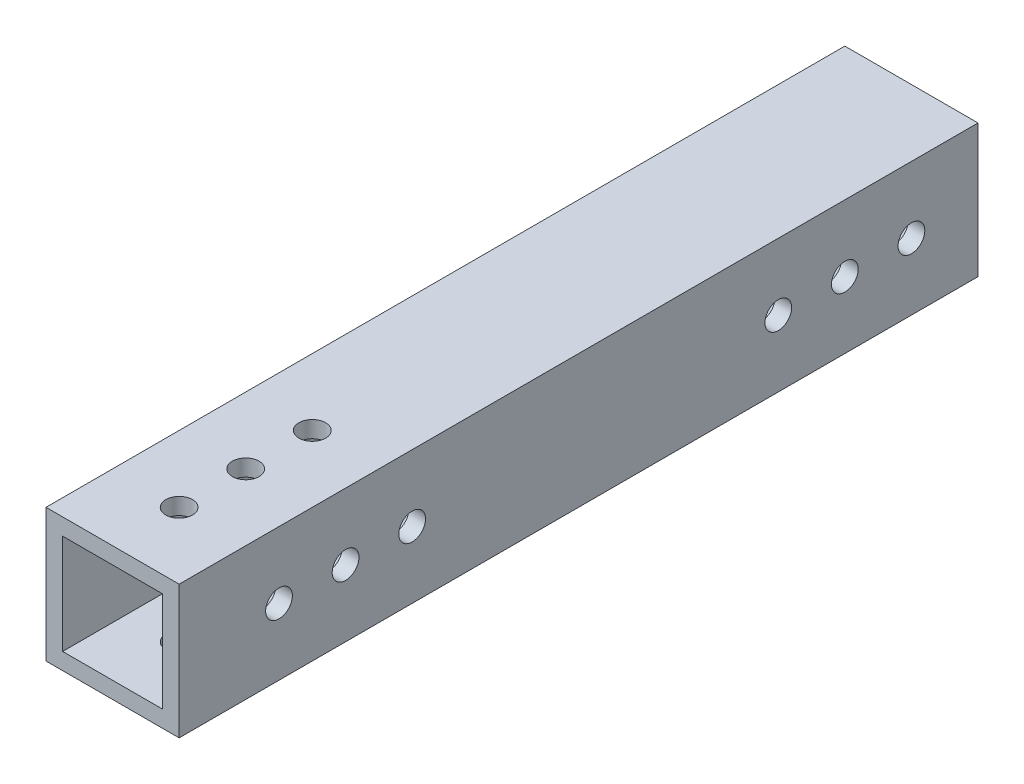
ISO-10303-21;
HEADER;
FILE_DESCRIPTION(('STEP AP214'),'2;1');
FILE_NAME('part.step','',(''),(''),'','','');
FILE_SCHEMA(('AUTOMOTIVE_DESIGN { 1 0 10303 214 1 1 1 1 }'));
ENDSEC;
DATA;
#1=APPLICATION_CONTEXT('core data for automotive mechanical design processes');
#2=APPLICATION_PROTOCOL_DEFINITION('international standard','automotive_design',2000,#1);
#3=PRODUCT_CONTEXT('',#1,'mechanical');
#4=PRODUCT('Part','Part','',(#3));
#5=PRODUCT_RELATED_PRODUCT_CATEGORY('part','',(#4));
#6=PRODUCT_DEFINITION_FORMATION('','',#4);
#7=PRODUCT_DEFINITION_CONTEXT('part definition',#1,'design');
#8=PRODUCT_DEFINITION('design','',#6,#7);
#9=PRODUCT_DEFINITION_SHAPE('','',#8);
#10=(LENGTH_UNIT() NAMED_UNIT(*) SI_UNIT(.MILLI.,.METRE.));
#11=(NAMED_UNIT(*) PLANE_ANGLE_UNIT() SI_UNIT($,.RADIAN.));
#12=(NAMED_UNIT(*) SI_UNIT($,.STERADIAN.) SOLID_ANGLE_UNIT());
#13=UNCERTAINTY_MEASURE_WITH_UNIT(LENGTH_MEASURE(1.E-05),#10,'distance_accuracy_value','');
#14=(GEOMETRIC_REPRESENTATION_CONTEXT(3) GLOBAL_UNCERTAINTY_ASSIGNED_CONTEXT((#13)) GLOBAL_UNIT_ASSIGNED_CONTEXT((#10,
#11,#12)) REPRESENTATION_CONTEXT('',''));
#15=CARTESIAN_POINT('',(0.,0.,0.));
#16=DIRECTION('',(0.,0.,1.));
#17=DIRECTION('',(1.,0.,0.));
#18=AXIS2_PLACEMENT_3D('',#15,#16,#17);
#19=CARTESIAN_POINT('',(0.,0.,152.4));
#20=DIRECTION('',(-1.,0.,0.));
#21=DIRECTION('',(0.,-1.,0.));
#22=AXIS2_PLACEMENT_3D('',#19,#20,#21);
#23=PLANE('',#22);
#24=CARTESIAN_POINT('',(0.,12.7,12.7));
#25=DIRECTION('',(1.,0.,0.));
#26=DIRECTION('',(0.,0.,-1.));
#27=AXIS2_PLACEMENT_3D('',#24,#25,#26);
#28=CIRCLE('',#27,2.55269999999999);
#29=CARTESIAN_POINT('',(0.,12.7,10.1473));
#30=VERTEX_POINT('',#29);
#31=EDGE_CURVE('E299',#30,#30,#28,.T.);
#32=ORIENTED_EDGE('',*,*,#31,.F.);
#33=EDGE_LOOP('',(#32));
#34=FACE_BOUND('',#33,.T.);
#35=CARTESIAN_POINT('',(0.,12.7,25.4));
#36=DIRECTION('',(1.,0.,0.));
#37=DIRECTION('',(0.,0.,-1.));
#38=AXIS2_PLACEMENT_3D('',#35,#36,#37);
#39=CIRCLE('',#38,2.55269999999999);
#40=CARTESIAN_POINT('',(0.,12.7,22.8473));
#41=VERTEX_POINT('',#40);
#42=EDGE_CURVE('E211',#41,#41,#39,.T.);
#43=ORIENTED_EDGE('',*,*,#42,.F.);
#44=EDGE_LOOP('',(#43));
#45=FACE_BOUND('',#44,.T.);
#46=CARTESIAN_POINT('',(0.,12.7,38.1));
#47=DIRECTION('',(1.,0.,0.));
#48=DIRECTION('',(0.,0.,-1.));
#49=AXIS2_PLACEMENT_3D('',#46,#47,#48);
#50=CIRCLE('',#49,2.55269999999999);
#51=CARTESIAN_POINT('',(0.,12.7,35.5473));
#52=VERTEX_POINT('',#51);
#53=EDGE_CURVE('E208',#52,#52,#50,.T.);
#54=ORIENTED_EDGE('',*,*,#53,.F.);
#55=EDGE_LOOP('',(#54));
#56=FACE_BOUND('',#55,.T.);
#57=CARTESIAN_POINT('',(0.,12.7,107.95));
#58=DIRECTION('',(-1.,0.,0.));
#59=DIRECTION('',(0.,-1.,0.));
#60=AXIS2_PLACEMENT_3D('',#57,#58,#59);
#61=CIRCLE('',#60,2.55269999999999);
#62=CARTESIAN_POINT('',(0.,10.1473,107.95));
#63=VERTEX_POINT('',#62);
#64=EDGE_CURVE('E186',#63,#63,#61,.F.);
#65=ORIENTED_EDGE('',*,*,#64,.F.);
#66=EDGE_LOOP('',(#65));
#67=FACE_BOUND('',#66,.T.);
#68=DIRECTION('',(0.,1.,0.));
#69=VECTOR('',#68,1.);
#70=CARTESIAN_POINT('',(0.,0.,0.));
#71=LINE('',#70,#69);
#72=CARTESIAN_POINT('',(0.,0.,0.));
#73=VERTEX_POINT('',#72);
#74=CARTESIAN_POINT('',(0.,25.4,0.));
#75=VERTEX_POINT('',#74);
#76=EDGE_CURVE('E120',#73,#75,#71,.T.);
#77=ORIENTED_EDGE('',*,*,#76,.T.);
#78=DIRECTION('',(0.,0.,-1.));
#79=VECTOR('',#78,1.);
#80=CARTESIAN_POINT('',(0.,25.4,152.4));
#81=LINE('',#80,#79);
#82=CARTESIAN_POINT('',(0.,25.4,152.4));
#83=VERTEX_POINT('',#82);
#84=EDGE_CURVE('E11',#83,#75,#81,.T.);
#85=ORIENTED_EDGE('',*,*,#84,.F.);
#86=DIRECTION('',(0.,1.,0.));
#87=VECTOR('',#86,1.);
#88=CARTESIAN_POINT('',(0.,0.,152.4));
#89=LINE('',#88,#87);
#90=CARTESIAN_POINT('',(0.,0.,152.4));
#91=VERTEX_POINT('',#90);
#92=EDGE_CURVE('E143',#91,#83,#89,.T.);
#93=ORIENTED_EDGE('',*,*,#92,.F.);
#94=DIRECTION('',(0.,0.,-1.));
#95=VECTOR('',#94,1.);
#96=CARTESIAN_POINT('',(0.,0.,152.4));
#97=LINE('',#96,#95);
#98=EDGE_CURVE('E153',#91,#73,#97,.T.);
#99=ORIENTED_EDGE('',*,*,#98,.T.);
#100=EDGE_LOOP('',(#77,#85,#93,#99));
#101=FACE_BOUND('',#100,.T.);
#102=CARTESIAN_POINT('',(0.,12.7,120.65));
#103=DIRECTION('',(-1.,0.,0.));
#104=DIRECTION('',(0.,-1.,0.));
#105=AXIS2_PLACEMENT_3D('',#102,#103,#104);
#106=CIRCLE('',#105,2.55269999999999);
#107=CARTESIAN_POINT('',(0.,10.1473,120.65));
#108=VERTEX_POINT('',#107);
#109=EDGE_CURVE('E191',#108,#108,#106,.F.);
#110=ORIENTED_EDGE('',*,*,#109,.F.);
#111=EDGE_LOOP('',(#110));
#112=FACE_BOUND('',#111,.T.);
#113=CARTESIAN_POINT('',(0.,12.7,133.35));
#114=DIRECTION('',(-1.,0.,0.));
#115=DIRECTION('',(0.,-1.,0.));
#116=AXIS2_PLACEMENT_3D('',#113,#114,#115);
#117=CIRCLE('',#116,2.55269999999999);
#118=CARTESIAN_POINT('',(0.,10.1473,133.35));
#119=VERTEX_POINT('',#118);
#120=EDGE_CURVE('E196',#119,#119,#117,.F.);
#121=ORIENTED_EDGE('',*,*,#120,.F.);
#122=EDGE_LOOP('',(#121));
#123=FACE_BOUND('',#122,.T.);
#124=ADVANCED_FACE('F38',(#34,#45,#56,#67,#101,#112,#123),#23,.F.);
#125=CARTESIAN_POINT('',(0.,0.,152.4));
#126=DIRECTION('',(0.,1.,0.));
#127=DIRECTION('',(0.,0.,1.));
#128=AXIS2_PLACEMENT_3D('',#125,#126,#127);
#129=PLANE('',#128);
#130=CARTESIAN_POINT('',(-12.7,0.,114.3));
#131=DIRECTION('',(0.,1.,0.));
#132=DIRECTION('',(0.,0.,1.));
#133=AXIS2_PLACEMENT_3D('',#130,#131,#132);
#134=CIRCLE('',#133,2.55269999999999);
#135=CARTESIAN_POINT('',(-12.7,0.,116.8527));
#136=VERTEX_POINT('',#135);
#137=EDGE_CURVE('E171',#136,#136,#134,.F.);
#138=ORIENTED_EDGE('',*,*,#137,.F.);
#139=EDGE_LOOP('',(#138));
#140=FACE_BOUND('',#139,.T.);
#141=DIRECTION('',(1.,0.,0.));
#142=VECTOR('',#141,1.);
#143=CARTESIAN_POINT('',(0.,0.,0.));
#144=LINE('',#143,#142);
#145=CARTESIAN_POINT('',(-25.4,0.,0.));
#146=VERTEX_POINT('',#145);
#147=EDGE_CURVE('E147',#146,#73,#144,.T.);
#148=ORIENTED_EDGE('',*,*,#147,.T.);
#149=ORIENTED_EDGE('',*,*,#98,.F.);
#150=DIRECTION('',(1.,0.,0.));
#151=VECTOR('',#150,1.);
#152=CARTESIAN_POINT('',(0.,0.,152.4));
#153=LINE('',#152,#151);
#154=CARTESIAN_POINT('',(-25.4,0.,152.4));
#155=VERTEX_POINT('',#154);
#156=EDGE_CURVE('E151',#155,#91,#153,.T.);
#157=ORIENTED_EDGE('',*,*,#156,.F.);
#158=DIRECTION('',(0.,0.,-1.));
#159=VECTOR('',#158,1.);
#160=CARTESIAN_POINT('',(-25.4,0.,152.4));
#161=LINE('',#160,#159);
#162=EDGE_CURVE('E163',#155,#146,#161,.T.);
#163=ORIENTED_EDGE('',*,*,#162,.T.);
#164=EDGE_LOOP('',(#148,#149,#157,#163));
#165=FACE_BOUND('',#164,.T.);
#166=CARTESIAN_POINT('',(-12.7,0.,127.));
#167=DIRECTION('',(0.,1.,0.));
#168=DIRECTION('',(0.,0.,1.));
#169=AXIS2_PLACEMENT_3D('',#166,#167,#168);
#170=CIRCLE('',#169,2.55269999999999);
#171=CARTESIAN_POINT('',(-12.7,0.,129.5527));
#172=VERTEX_POINT('',#171);
#173=EDGE_CURVE('E176',#172,#172,#170,.F.);
#174=ORIENTED_EDGE('',*,*,#173,.F.);
#175=EDGE_LOOP('',(#174));
#176=FACE_BOUND('',#175,.T.);
#177=CARTESIAN_POINT('',(-12.7,0.,139.7));
#178=DIRECTION('',(0.,1.,0.));
#179=DIRECTION('',(0.,0.,1.));
#180=AXIS2_PLACEMENT_3D('',#177,#178,#179);
#181=CIRCLE('',#180,2.55269999999999);
#182=CARTESIAN_POINT('',(-12.7,0.,142.2527));
#183=VERTEX_POINT('',#182);
#184=EDGE_CURVE('E181',#183,#183,#181,.F.);
#185=ORIENTED_EDGE('',*,*,#184,.F.);
#186=EDGE_LOOP('',(#185));
#187=FACE_BOUND('',#186,.T.);
#188=ADVANCED_FACE('F289',(#140,#165,#176,#187),#129,.F.);
#189=CARTESIAN_POINT('',(0.,0.,152.4));
#190=DIRECTION('',(0.,0.,1.));
#191=DIRECTION('',(1.,0.,0.));
#192=AXIS2_PLACEMENT_3D('',#189,#190,#191);
#193=PLANE('',#192);
#194=ORIENTED_EDGE('',*,*,#92,.T.);
#195=DIRECTION('',(-1.,0.,0.));
#196=VECTOR('',#195,1.);
#197=CARTESIAN_POINT('',(0.,25.4,152.4));
#198=LINE('',#197,#196);
#199=CARTESIAN_POINT('',(-25.4,25.4,152.4));
#200=VERTEX_POINT('',#199);
#201=EDGE_CURVE('E146',#83,#200,#198,.T.);
#202=ORIENTED_EDGE('',*,*,#201,.T.);
#203=DIRECTION('',(0.,-1.,0.));
#204=VECTOR('',#203,1.);
#205=CARTESIAN_POINT('',(-25.4,0.,152.4));
#206=LINE('',#205,#204);
#207=EDGE_CURVE('E149',#200,#155,#206,.T.);
#208=ORIENTED_EDGE('',*,*,#207,.T.);
#209=ORIENTED_EDGE('',*,*,#156,.T.);
#210=EDGE_LOOP('',(#194,#202,#208,#209));
#211=FACE_BOUND('',#210,.T.);
#212=DIRECTION('',(-1.,0.,0.));
#213=VECTOR('',#212,1.);
#214=CARTESIAN_POINT('',(-3.175,22.225,152.4));
#215=LINE('',#214,#213);
#216=CARTESIAN_POINT('',(-3.175,22.225,152.4));
#217=VERTEX_POINT('',#216);
#218=CARTESIAN_POINT('',(-22.225,22.225,152.4));
#219=VERTEX_POINT('',#218);
#220=EDGE_CURVE('E112',#217,#219,#215,.T.);
#221=ORIENTED_EDGE('',*,*,#220,.F.);
#222=DIRECTION('',(0.,1.,0.));
#223=VECTOR('',#222,1.);
#224=CARTESIAN_POINT('',(-3.175,3.175,152.4));
#225=LINE('',#224,#223);
#226=CARTESIAN_POINT('',(-3.175,3.175,152.4));
#227=VERTEX_POINT('',#226);
#228=EDGE_CURVE('E104',#227,#217,#225,.T.);
#229=ORIENTED_EDGE('',*,*,#228,.F.);
#230=DIRECTION('',(1.,0.,0.));
#231=VECTOR('',#230,1.);
#232=CARTESIAN_POINT('',(-3.175,3.175,152.4));
#233=LINE('',#232,#231);
#234=CARTESIAN_POINT('',(-22.225,3.175,152.4));
#235=VERTEX_POINT('',#234);
#236=EDGE_CURVE('E127',#235,#227,#233,.T.);
#237=ORIENTED_EDGE('',*,*,#236,.F.);
#238=DIRECTION('',(0.,-1.,0.));
#239=VECTOR('',#238,1.);
#240=CARTESIAN_POINT('',(-22.225,3.175,152.4));
#241=LINE('',#240,#239);
#242=EDGE_CURVE('E125',#219,#235,#241,.T.);
#243=ORIENTED_EDGE('',*,*,#242,.F.);
#244=EDGE_LOOP('',(#221,#229,#237,#243));
#245=FACE_BOUND('',#244,.T.);
#246=ADVANCED_FACE('F124',(#211,#245),#193,.T.);
#247=CARTESIAN_POINT('',(0.,0.,0.));
#248=DIRECTION('',(0.,0.,1.));
#249=DIRECTION('',(1.,0.,0.));
#250=AXIS2_PLACEMENT_3D('',#247,#248,#249);
#251=PLANE('',#250);
#252=ORIENTED_EDGE('',*,*,#76,.F.);
#253=ORIENTED_EDGE('',*,*,#147,.F.);
#254=DIRECTION('',(0.,-1.,0.));
#255=VECTOR('',#254,1.);
#256=CARTESIAN_POINT('',(-25.4,0.,0.));
#257=LINE('',#256,#255);
#258=CARTESIAN_POINT('',(-25.4,25.4,0.));
#259=VERTEX_POINT('',#258);
#260=EDGE_CURVE('E158',#259,#146,#257,.T.);
#261=ORIENTED_EDGE('',*,*,#260,.F.);
#262=DIRECTION('',(-1.,0.,0.));
#263=VECTOR('',#262,1.);
#264=CARTESIAN_POINT('',(0.,25.4,0.));
#265=LINE('',#264,#263);
#266=EDGE_CURVE('E156',#75,#259,#265,.T.);
#267=ORIENTED_EDGE('',*,*,#266,.F.);
#268=EDGE_LOOP('',(#252,#253,#261,#267));
#269=FACE_BOUND('',#268,.T.);
#270=DIRECTION('',(0.,1.,0.));
#271=VECTOR('',#270,1.);
#272=CARTESIAN_POINT('',(-3.175,3.175,0.));
#273=LINE('',#272,#271);
#274=CARTESIAN_POINT('',(-3.175,3.175,0.));
#275=VERTEX_POINT('',#274);
#276=CARTESIAN_POINT('',(-3.175,22.225,0.));
#277=VERTEX_POINT('',#276);
#278=EDGE_CURVE('E62',#275,#277,#273,.T.);
#279=ORIENTED_EDGE('',*,*,#278,.T.);
#280=DIRECTION('',(-1.,0.,0.));
#281=VECTOR('',#280,1.);
#282=CARTESIAN_POINT('',(-3.175,22.225,0.));
#283=LINE('',#282,#281);
#284=CARTESIAN_POINT('',(-22.225,22.225,0.));
#285=VERTEX_POINT('',#284);
#286=EDGE_CURVE('E119',#277,#285,#283,.T.);
#287=ORIENTED_EDGE('',*,*,#286,.T.);
#288=DIRECTION('',(0.,-1.,0.));
#289=VECTOR('',#288,1.);
#290=CARTESIAN_POINT('',(-22.225,3.175,0.));
#291=LINE('',#290,#289);
#292=CARTESIAN_POINT('',(-22.225,3.175,0.));
#293=VERTEX_POINT('',#292);
#294=EDGE_CURVE('E135',#285,#293,#291,.T.);
#295=ORIENTED_EDGE('',*,*,#294,.T.);
#296=DIRECTION('',(1.,0.,0.));
#297=VECTOR('',#296,1.);
#298=CARTESIAN_POINT('',(-3.175,3.175,0.));
#299=LINE('',#298,#297);
#300=EDGE_CURVE('E113',#293,#275,#299,.T.);
#301=ORIENTED_EDGE('',*,*,#300,.T.);
#302=EDGE_LOOP('',(#279,#287,#295,#301));
#303=FACE_BOUND('',#302,.T.);
#304=ADVANCED_FACE('F364',(#269,#303),#251,.F.);
#305=CARTESIAN_POINT('',(0.,25.4,152.4));
#306=DIRECTION('',(0.,-1.,0.));
#307=DIRECTION('',(1.,0.,0.));
#308=AXIS2_PLACEMENT_3D('',#305,#306,#307);
#309=PLANE('',#308);
#310=CARTESIAN_POINT('',(-12.7,25.4,139.7));
#311=DIRECTION('',(0.,1.,0.));
#312=DIRECTION('',(0.,0.,1.));
#313=AXIS2_PLACEMENT_3D('',#310,#311,#312);
#314=CIRCLE('',#313,2.55269999999999);
#315=CARTESIAN_POINT('',(-12.7,25.4,142.2527));
#316=VERTEX_POINT('',#315);
#317=EDGE_CURVE('E248',#316,#316,#314,.T.);
#318=ORIENTED_EDGE('',*,*,#317,.F.);
#319=EDGE_LOOP('',(#318));
#320=FACE_BOUND('',#319,.T.);
#321=CARTESIAN_POINT('',(-12.7,25.4,127.));
#322=DIRECTION('',(0.,1.,0.));
#323=DIRECTION('',(0.,0.,1.));
#324=AXIS2_PLACEMENT_3D('',#321,#322,#323);
#325=CIRCLE('',#324,2.55269999999999);
#326=CARTESIAN_POINT('',(-12.7,25.4,129.5527));
#327=VERTEX_POINT('',#326);
#328=EDGE_CURVE('E255',#327,#327,#325,.T.);
#329=ORIENTED_EDGE('',*,*,#328,.F.);
#330=EDGE_LOOP('',(#329));
#331=FACE_BOUND('',#330,.T.);
#332=CARTESIAN_POINT('',(-12.7,25.4,114.3));
#333=DIRECTION('',(0.,1.,0.));
#334=DIRECTION('',(0.,0.,1.));
#335=AXIS2_PLACEMENT_3D('',#332,#333,#334);
#336=CIRCLE('',#335,2.55269999999999);
#337=CARTESIAN_POINT('',(-12.7,25.4,116.8527));
#338=VERTEX_POINT('',#337);
#339=EDGE_CURVE('E262',#338,#338,#336,.T.);
#340=ORIENTED_EDGE('',*,*,#339,.F.);
#341=EDGE_LOOP('',(#340));
#342=FACE_BOUND('',#341,.T.);
#343=ORIENTED_EDGE('',*,*,#266,.T.);
#344=DIRECTION('',(0.,0.,-1.));
#345=VECTOR('',#344,1.);
#346=CARTESIAN_POINT('',(-25.4,25.4,152.4));
#347=LINE('',#346,#345);
#348=EDGE_CURVE('E46',#200,#259,#347,.T.);
#349=ORIENTED_EDGE('',*,*,#348,.F.);
#350=ORIENTED_EDGE('',*,*,#201,.F.);
#351=ORIENTED_EDGE('',*,*,#84,.T.);
#352=EDGE_LOOP('',(#343,#349,#350,#351));
#353=FACE_BOUND('',#352,.T.);
#354=ADVANCED_FACE('F367',(#320,#331,#342,#353),#309,.F.);
#355=CARTESIAN_POINT('',(-25.4,0.,152.4));
#356=DIRECTION('',(1.,0.,0.));
#357=DIRECTION('',(0.,0.,-1.));
#358=AXIS2_PLACEMENT_3D('',#355,#356,#357);
#359=PLANE('',#358);
#360=CARTESIAN_POINT('',(-25.4,12.7,12.7));
#361=DIRECTION('',(1.,0.,0.));
#362=DIRECTION('',(0.,0.,-1.));
#363=AXIS2_PLACEMENT_3D('',#360,#361,#362);
#364=CIRCLE('',#363,2.55269999999999);
#365=CARTESIAN_POINT('',(-25.4,12.7,10.1473));
#366=VERTEX_POINT('',#365);
#367=EDGE_CURVE('E385',#366,#366,#364,.F.);
#368=ORIENTED_EDGE('',*,*,#367,.F.);
#369=EDGE_LOOP('',(#368));
#370=FACE_BOUND('',#369,.T.);
#371=CARTESIAN_POINT('',(-25.4,12.7,25.4));
#372=DIRECTION('',(1.,0.,0.));
#373=DIRECTION('',(0.,0.,-1.));
#374=AXIS2_PLACEMENT_3D('',#371,#372,#373);
#375=CIRCLE('',#374,2.55269999999999);
#376=CARTESIAN_POINT('',(-25.4,12.7,22.8473));
#377=VERTEX_POINT('',#376);
#378=EDGE_CURVE('E204',#377,#377,#375,.F.);
#379=ORIENTED_EDGE('',*,*,#378,.F.);
#380=EDGE_LOOP('',(#379));
#381=FACE_BOUND('',#380,.T.);
#382=CARTESIAN_POINT('',(-25.4,12.7,38.1));
#383=DIRECTION('',(1.,0.,0.));
#384=DIRECTION('',(0.,0.,-1.));
#385=AXIS2_PLACEMENT_3D('',#382,#383,#384);
#386=CIRCLE('',#385,2.55269999999999);
#387=CARTESIAN_POINT('',(-25.4,12.7,35.5473));
#388=VERTEX_POINT('',#387);
#389=EDGE_CURVE('E200',#388,#388,#386,.F.);
#390=ORIENTED_EDGE('',*,*,#389,.F.);
#391=EDGE_LOOP('',(#390));
#392=FACE_BOUND('',#391,.T.);
#393=CARTESIAN_POINT('',(-25.4,12.7,133.35));
#394=DIRECTION('',(-1.,0.,0.));
#395=DIRECTION('',(0.,0.,1.));
#396=AXIS2_PLACEMENT_3D('',#393,#394,#395);
#397=CIRCLE('',#396,2.55269999999999);
#398=CARTESIAN_POINT('',(-25.4,12.7,135.9027));
#399=VERTEX_POINT('',#398);
#400=EDGE_CURVE('E227',#399,#399,#397,.T.);
#401=ORIENTED_EDGE('',*,*,#400,.F.);
#402=EDGE_LOOP('',(#401));
#403=FACE_BOUND('',#402,.T.);
#404=CARTESIAN_POINT('',(-25.4,12.7,120.65));
#405=DIRECTION('',(-1.,0.,0.));
#406=DIRECTION('',(0.,0.,1.));
#407=AXIS2_PLACEMENT_3D('',#404,#405,#406);
#408=CIRCLE('',#407,2.55269999999999);
#409=CARTESIAN_POINT('',(-25.4,12.7,123.2027));
#410=VERTEX_POINT('',#409);
#411=EDGE_CURVE('E234',#410,#410,#408,.T.);
#412=ORIENTED_EDGE('',*,*,#411,.F.);
#413=EDGE_LOOP('',(#412));
#414=FACE_BOUND('',#413,.T.);
#415=CARTESIAN_POINT('',(-25.4,12.7,107.95));
#416=DIRECTION('',(-1.,0.,0.));
#417=DIRECTION('',(0.,0.,1.));
#418=AXIS2_PLACEMENT_3D('',#415,#416,#417);
#419=CIRCLE('',#418,2.55269999999999);
#420=CARTESIAN_POINT('',(-25.4,12.7,110.5027));
#421=VERTEX_POINT('',#420);
#422=EDGE_CURVE('E241',#421,#421,#419,.T.);
#423=ORIENTED_EDGE('',*,*,#422,.F.);
#424=EDGE_LOOP('',(#423));
#425=FACE_BOUND('',#424,.T.);
#426=ORIENTED_EDGE('',*,*,#260,.T.);
#427=ORIENTED_EDGE('',*,*,#162,.F.);
#428=ORIENTED_EDGE('',*,*,#207,.F.);
#429=ORIENTED_EDGE('',*,*,#348,.T.);
#430=EDGE_LOOP('',(#426,#427,#428,#429));
#431=FACE_BOUND('',#430,.T.);
#432=ADVANCED_FACE('F283',(#370,#381,#392,#403,#414,#425,#431),#359,.F.);
#433=CARTESIAN_POINT('',(-3.175,3.175,152.4));
#434=DIRECTION('',(-1.,0.,0.));
#435=DIRECTION('',(0.,-1.,0.));
#436=AXIS2_PLACEMENT_3D('',#433,#434,#435);
#437=PLANE('',#436);
#438=CARTESIAN_POINT('',(-3.175,12.7,12.7));
#439=DIRECTION('',(-1.,0.,0.));
#440=DIRECTION('',(0.,-1.,0.));
#441=AXIS2_PLACEMENT_3D('',#438,#439,#440);
#442=CIRCLE('',#441,2.55269999999999);
#443=CARTESIAN_POINT('',(-3.175,10.1473,12.7));
#444=VERTEX_POINT('',#443);
#445=EDGE_CURVE('E216',#444,#444,#442,.T.);
#446=ORIENTED_EDGE('',*,*,#445,.F.);
#447=EDGE_LOOP('',(#446));
#448=FACE_BOUND('',#447,.T.);
#449=CARTESIAN_POINT('',(-3.175,12.7,25.4));
#450=DIRECTION('',(-1.,0.,0.));
#451=DIRECTION('',(0.,-1.,0.));
#452=AXIS2_PLACEMENT_3D('',#449,#450,#451);
#453=CIRCLE('',#452,2.55269999999999);
#454=CARTESIAN_POINT('',(-3.175,10.1473,25.4));
#455=VERTEX_POINT('',#454);
#456=EDGE_CURVE('E203',#455,#455,#453,.T.);
#457=ORIENTED_EDGE('',*,*,#456,.F.);
#458=EDGE_LOOP('',(#457));
#459=FACE_BOUND('',#458,.T.);
#460=CARTESIAN_POINT('',(-3.175,12.7,38.1));
#461=DIRECTION('',(-1.,0.,0.));
#462=DIRECTION('',(0.,-1.,0.));
#463=AXIS2_PLACEMENT_3D('',#460,#461,#462);
#464=CIRCLE('',#463,2.55269999999999);
#465=CARTESIAN_POINT('',(-3.175,10.1473,38.1));
#466=VERTEX_POINT('',#465);
#467=EDGE_CURVE('E199',#466,#466,#464,.T.);
#468=ORIENTED_EDGE('',*,*,#467,.F.);
#469=EDGE_LOOP('',(#468));
#470=FACE_BOUND('',#469,.T.);
#471=CARTESIAN_POINT('',(-3.175,12.7,133.35));
#472=DIRECTION('',(-1.,0.,0.));
#473=DIRECTION('',(0.,-1.,0.));
#474=AXIS2_PLACEMENT_3D('',#471,#472,#473);
#475=CIRCLE('',#474,2.55269999999999);
#476=CARTESIAN_POINT('',(-3.175,10.1473,133.35));
#477=VERTEX_POINT('',#476);
#478=EDGE_CURVE('E195',#477,#477,#475,.T.);
#479=ORIENTED_EDGE('',*,*,#478,.F.);
#480=EDGE_LOOP('',(#479));
#481=FACE_BOUND('',#480,.T.);
#482=CARTESIAN_POINT('',(-3.175,12.7,120.65));
#483=DIRECTION('',(-1.,0.,0.));
#484=DIRECTION('',(0.,-1.,0.));
#485=AXIS2_PLACEMENT_3D('',#482,#483,#484);
#486=CIRCLE('',#485,2.55269999999999);
#487=CARTESIAN_POINT('',(-3.175,10.1473,120.65));
#488=VERTEX_POINT('',#487);
#489=EDGE_CURVE('E190',#488,#488,#486,.T.);
#490=ORIENTED_EDGE('',*,*,#489,.F.);
#491=EDGE_LOOP('',(#490));
#492=FACE_BOUND('',#491,.T.);
#493=CARTESIAN_POINT('',(-3.175,12.7,107.95));
#494=DIRECTION('',(-1.,0.,0.));
#495=DIRECTION('',(0.,-1.,0.));
#496=AXIS2_PLACEMENT_3D('',#493,#494,#495);
#497=CIRCLE('',#496,2.55269999999999);
#498=CARTESIAN_POINT('',(-3.175,10.1473,107.95));
#499=VERTEX_POINT('',#498);
#500=EDGE_CURVE('E185',#499,#499,#497,.T.);
#501=ORIENTED_EDGE('',*,*,#500,.F.);
#502=EDGE_LOOP('',(#501));
#503=FACE_BOUND('',#502,.T.);
#504=ORIENTED_EDGE('',*,*,#278,.F.);
#505=DIRECTION('',(0.,0.,-1.));
#506=VECTOR('',#505,1.);
#507=CARTESIAN_POINT('',(-3.175,3.175,152.4));
#508=LINE('',#507,#506);
#509=EDGE_CURVE('E108',#227,#275,#508,.T.);
#510=ORIENTED_EDGE('',*,*,#509,.F.);
#511=ORIENTED_EDGE('',*,*,#228,.T.);
#512=DIRECTION('',(0.,0.,-1.));
#513=VECTOR('',#512,1.);
#514=CARTESIAN_POINT('',(-3.175,22.225,152.4));
#515=LINE('',#514,#513);
#516=EDGE_CURVE('E107',#217,#277,#515,.T.);
#517=ORIENTED_EDGE('',*,*,#516,.T.);
#518=EDGE_LOOP('',(#504,#510,#511,#517));
#519=FACE_BOUND('',#518,.T.);
#520=ADVANCED_FACE('F106',(#448,#459,#470,#481,#492,#503,#519),#437,.T.);
#521=CARTESIAN_POINT('',(-3.175,22.225,152.4));
#522=DIRECTION('',(0.,-1.,0.));
#523=DIRECTION('',(0.,0.,-1.));
#524=AXIS2_PLACEMENT_3D('',#521,#522,#523);
#525=PLANE('',#524);
#526=CARTESIAN_POINT('',(-12.7,22.225,139.7));
#527=DIRECTION('',(0.,-1.,0.));
#528=DIRECTION('',(0.,0.,-1.));
#529=AXIS2_PLACEMENT_3D('',#526,#527,#528);
#530=CIRCLE('',#529,2.55269999999999);
#531=CARTESIAN_POINT('',(-12.7,22.225,137.1473));
#532=VERTEX_POINT('',#531);
#533=EDGE_CURVE('E180',#532,#532,#530,.T.);
#534=ORIENTED_EDGE('',*,*,#533,.F.);
#535=EDGE_LOOP('',(#534));
#536=FACE_BOUND('',#535,.T.);
#537=CARTESIAN_POINT('',(-12.7,22.225,127.));
#538=DIRECTION('',(0.,-1.,0.));
#539=DIRECTION('',(0.,0.,-1.));
#540=AXIS2_PLACEMENT_3D('',#537,#538,#539);
#541=CIRCLE('',#540,2.55269999999999);
#542=CARTESIAN_POINT('',(-12.7,22.225,124.4473));
#543=VERTEX_POINT('',#542);
#544=EDGE_CURVE('E172',#543,#543,#541,.T.);
#545=ORIENTED_EDGE('',*,*,#544,.F.);
#546=EDGE_LOOP('',(#545));
#547=FACE_BOUND('',#546,.T.);
#548=CARTESIAN_POINT('',(-12.7,22.225,114.3));
#549=DIRECTION('',(0.,-1.,0.));
#550=DIRECTION('',(0.,0.,-1.));
#551=AXIS2_PLACEMENT_3D('',#548,#549,#550);
#552=CIRCLE('',#551,2.55269999999999);
#553=CARTESIAN_POINT('',(-12.7,22.225,111.7473));
#554=VERTEX_POINT('',#553);
#555=EDGE_CURVE('E133',#554,#554,#552,.T.);
#556=ORIENTED_EDGE('',*,*,#555,.F.);
#557=EDGE_LOOP('',(#556));
#558=FACE_BOUND('',#557,.T.);
#559=ORIENTED_EDGE('',*,*,#286,.F.);
#560=ORIENTED_EDGE('',*,*,#516,.F.);
#561=ORIENTED_EDGE('',*,*,#220,.T.);
#562=DIRECTION('',(0.,0.,-1.));
#563=VECTOR('',#562,1.);
#564=CARTESIAN_POINT('',(-22.225,22.225,152.4));
#565=LINE('',#564,#563);
#566=EDGE_CURVE('E121',#219,#285,#565,.T.);
#567=ORIENTED_EDGE('',*,*,#566,.T.);
#568=EDGE_LOOP('',(#559,#560,#561,#567));
#569=FACE_BOUND('',#568,.T.);
#570=ADVANCED_FACE('F116',(#536,#547,#558,#569),#525,.T.);
#571=CARTESIAN_POINT('',(-22.225,3.175,152.4));
#572=DIRECTION('',(1.,0.,0.));
#573=DIRECTION('',(0.,0.,-1.));
#574=AXIS2_PLACEMENT_3D('',#571,#572,#573);
#575=PLANE('',#574);
#576=CARTESIAN_POINT('',(-22.225,12.7,12.7));
#577=DIRECTION('',(1.,0.,0.));
#578=DIRECTION('',(0.,0.,-1.));
#579=AXIS2_PLACEMENT_3D('',#576,#577,#578);
#580=CIRCLE('',#579,2.55269999999999);
#581=CARTESIAN_POINT('',(-22.225,12.7,10.1473));
#582=VERTEX_POINT('',#581);
#583=EDGE_CURVE('E41',#582,#582,#580,.T.);
#584=ORIENTED_EDGE('',*,*,#583,.F.);
#585=EDGE_LOOP('',(#584));
#586=FACE_BOUND('',#585,.T.);
#587=CARTESIAN_POINT('',(-22.225,12.7,25.4));
#588=DIRECTION('',(1.,0.,0.));
#589=DIRECTION('',(0.,0.,-1.));
#590=AXIS2_PLACEMENT_3D('',#587,#588,#589);
#591=CIRCLE('',#590,2.55269999999999);
#592=CARTESIAN_POINT('',(-22.225,12.7,22.8473));
#593=VERTEX_POINT('',#592);
#594=EDGE_CURVE('E201',#593,#593,#591,.T.);
#595=ORIENTED_EDGE('',*,*,#594,.F.);
#596=EDGE_LOOP('',(#595));
#597=FACE_BOUND('',#596,.T.);
#598=CARTESIAN_POINT('',(-22.225,12.7,38.1));
#599=DIRECTION('',(1.,0.,0.));
#600=DIRECTION('',(0.,0.,-1.));
#601=AXIS2_PLACEMENT_3D('',#598,#599,#600);
#602=CIRCLE('',#601,2.55269999999999);
#603=CARTESIAN_POINT('',(-22.225,12.7,35.5473));
#604=VERTEX_POINT('',#603);
#605=EDGE_CURVE('E197',#604,#604,#602,.T.);
#606=ORIENTED_EDGE('',*,*,#605,.F.);
#607=EDGE_LOOP('',(#606));
#608=FACE_BOUND('',#607,.T.);
#609=CARTESIAN_POINT('',(-22.225,12.7,133.35));
#610=DIRECTION('',(1.,0.,0.));
#611=DIRECTION('',(0.,0.,-1.));
#612=AXIS2_PLACEMENT_3D('',#609,#610,#611);
#613=CIRCLE('',#612,2.55269999999999);
#614=CARTESIAN_POINT('',(-22.225,12.7,130.7973));
#615=VERTEX_POINT('',#614);
#616=EDGE_CURVE('E192',#615,#615,#613,.T.);
#617=ORIENTED_EDGE('',*,*,#616,.F.);
#618=EDGE_LOOP('',(#617));
#619=FACE_BOUND('',#618,.T.);
#620=CARTESIAN_POINT('',(-22.225,12.7,120.65));
#621=DIRECTION('',(1.,0.,0.));
#622=DIRECTION('',(0.,0.,-1.));
#623=AXIS2_PLACEMENT_3D('',#620,#621,#622);
#624=CIRCLE('',#623,2.55269999999999);
#625=CARTESIAN_POINT('',(-22.225,12.7,118.0973));
#626=VERTEX_POINT('',#625);
#627=EDGE_CURVE('E187',#626,#626,#624,.T.);
#628=ORIENTED_EDGE('',*,*,#627,.F.);
#629=EDGE_LOOP('',(#628));
#630=FACE_BOUND('',#629,.T.);
#631=CARTESIAN_POINT('',(-22.225,12.7,107.95));
#632=DIRECTION('',(1.,0.,0.));
#633=DIRECTION('',(0.,0.,-1.));
#634=AXIS2_PLACEMENT_3D('',#631,#632,#633);
#635=CIRCLE('',#634,2.55269999999999);
#636=CARTESIAN_POINT('',(-22.225,12.7,105.3973));
#637=VERTEX_POINT('',#636);
#638=EDGE_CURVE('E182',#637,#637,#635,.T.);
#639=ORIENTED_EDGE('',*,*,#638,.F.);
#640=EDGE_LOOP('',(#639));
#641=FACE_BOUND('',#640,.T.);
#642=ORIENTED_EDGE('',*,*,#294,.F.);
#643=ORIENTED_EDGE('',*,*,#566,.F.);
#644=ORIENTED_EDGE('',*,*,#242,.T.);
#645=DIRECTION('',(0.,0.,-1.));
#646=VECTOR('',#645,1.);
#647=CARTESIAN_POINT('',(-22.225,3.175,152.4));
#648=LINE('',#647,#646);
#649=EDGE_CURVE('E54',#235,#293,#648,.T.);
#650=ORIENTED_EDGE('',*,*,#649,.T.);
#651=EDGE_LOOP('',(#642,#643,#644,#650));
#652=FACE_BOUND('',#651,.T.);
#653=ADVANCED_FACE('F273',(#586,#597,#608,#619,#630,#641,#652),#575,.T.);
#654=CARTESIAN_POINT('',(-3.175,3.175,152.4));
#655=DIRECTION('',(0.,1.,0.));
#656=DIRECTION('',(-1.,0.,0.));
#657=AXIS2_PLACEMENT_3D('',#654,#655,#656);
#658=PLANE('',#657);
#659=CARTESIAN_POINT('',(-12.7,3.175,139.7));
#660=DIRECTION('',(0.,1.,0.));
#661=DIRECTION('',(-1.,0.,0.));
#662=AXIS2_PLACEMENT_3D('',#659,#660,#661);
#663=CIRCLE('',#662,2.55269999999999);
#664=CARTESIAN_POINT('',(-15.2527,3.175,139.7));
#665=VERTEX_POINT('',#664);
#666=EDGE_CURVE('E177',#665,#665,#663,.T.);
#667=ORIENTED_EDGE('',*,*,#666,.F.);
#668=EDGE_LOOP('',(#667));
#669=FACE_BOUND('',#668,.T.);
#670=CARTESIAN_POINT('',(-12.7,3.175,127.));
#671=DIRECTION('',(0.,1.,0.));
#672=DIRECTION('',(-1.,0.,0.));
#673=AXIS2_PLACEMENT_3D('',#670,#671,#672);
#674=CIRCLE('',#673,2.55269999999999);
#675=CARTESIAN_POINT('',(-15.2527,3.175,127.));
#676=VERTEX_POINT('',#675);
#677=EDGE_CURVE('E175',#676,#676,#674,.T.);
#678=ORIENTED_EDGE('',*,*,#677,.F.);
#679=EDGE_LOOP('',(#678));
#680=FACE_BOUND('',#679,.T.);
#681=CARTESIAN_POINT('',(-12.7,3.175,114.3));
#682=DIRECTION('',(0.,1.,0.));
#683=DIRECTION('',(-1.,0.,0.));
#684=AXIS2_PLACEMENT_3D('',#681,#682,#683);
#685=CIRCLE('',#684,2.55269999999999);
#686=CARTESIAN_POINT('',(-15.2527,3.175,114.3));
#687=VERTEX_POINT('',#686);
#688=EDGE_CURVE('E168',#687,#687,#685,.T.);
#689=ORIENTED_EDGE('',*,*,#688,.F.);
#690=EDGE_LOOP('',(#689));
#691=FACE_BOUND('',#690,.T.);
#692=ORIENTED_EDGE('',*,*,#300,.F.);
#693=ORIENTED_EDGE('',*,*,#649,.F.);
#694=ORIENTED_EDGE('',*,*,#236,.T.);
#695=ORIENTED_EDGE('',*,*,#509,.T.);
#696=EDGE_LOOP('',(#692,#693,#694,#695));
#697=FACE_BOUND('',#696,.T.);
#698=ADVANCED_FACE('F280',(#669,#680,#691,#697),#658,.T.);
#699=CARTESIAN_POINT('',(-12.7,25.4,114.3));
#700=DIRECTION('',(0.,1.,0.));
#701=DIRECTION('',(0.,0.,1.));
#702=AXIS2_PLACEMENT_3D('',#699,#700,#701);
#703=CYLINDRICAL_SURFACE('',#702,2.55269999999999);
#704=ORIENTED_EDGE('',*,*,#688,.T.);
#705=EDGE_LOOP('',(#704));
#706=FACE_BOUND('',#705,.T.);
#707=ORIENTED_EDGE('',*,*,#137,.T.);
#708=EDGE_LOOP('',(#707));
#709=FACE_BOUND('',#708,.T.);
#710=ADVANCED_FACE('F349',(#706,#709),#703,.F.);
#711=ORIENTED_EDGE('',*,*,#555,.T.);
#712=EDGE_LOOP('',(#711));
#713=FACE_BOUND('',#712,.T.);
#714=ORIENTED_EDGE('',*,*,#339,.T.);
#715=EDGE_LOOP('',(#714));
#716=FACE_BOUND('',#715,.T.);
#717=ADVANCED_FACE('F269',(#713,#716),#703,.F.);
#718=CARTESIAN_POINT('',(-12.7,25.4,127.));
#719=DIRECTION('',(0.,1.,0.));
#720=DIRECTION('',(0.,0.,1.));
#721=AXIS2_PLACEMENT_3D('',#718,#719,#720);
#722=CYLINDRICAL_SURFACE('',#721,2.55269999999999);
#723=ORIENTED_EDGE('',*,*,#544,.T.);
#724=EDGE_LOOP('',(#723));
#725=FACE_BOUND('',#724,.T.);
#726=ORIENTED_EDGE('',*,*,#328,.T.);
#727=EDGE_LOOP('',(#726));
#728=FACE_BOUND('',#727,.T.);
#729=ADVANCED_FACE('F345',(#725,#728),#722,.F.);
#730=ORIENTED_EDGE('',*,*,#677,.T.);
#731=EDGE_LOOP('',(#730));
#732=FACE_BOUND('',#731,.T.);
#733=ORIENTED_EDGE('',*,*,#173,.T.);
#734=EDGE_LOOP('',(#733));
#735=FACE_BOUND('',#734,.T.);
#736=ADVANCED_FACE('F343',(#732,#735),#722,.F.);
#737=CARTESIAN_POINT('',(-12.7,25.4,139.7));
#738=DIRECTION('',(0.,1.,0.));
#739=DIRECTION('',(0.,0.,1.));
#740=AXIS2_PLACEMENT_3D('',#737,#738,#739);
#741=CYLINDRICAL_SURFACE('',#740,2.55269999999999);
#742=ORIENTED_EDGE('',*,*,#666,.T.);
#743=EDGE_LOOP('',(#742));
#744=FACE_BOUND('',#743,.T.);
#745=ORIENTED_EDGE('',*,*,#184,.T.);
#746=EDGE_LOOP('',(#745));
#747=FACE_BOUND('',#746,.T.);
#748=ADVANCED_FACE('F340',(#744,#747),#741,.F.);
#749=ORIENTED_EDGE('',*,*,#533,.T.);
#750=EDGE_LOOP('',(#749));
#751=FACE_BOUND('',#750,.T.);
#752=ORIENTED_EDGE('',*,*,#317,.T.);
#753=EDGE_LOOP('',(#752));
#754=FACE_BOUND('',#753,.T.);
#755=ADVANCED_FACE('F338',(#751,#754),#741,.F.);
#756=CARTESIAN_POINT('',(-25.4,12.7,107.95));
#757=DIRECTION('',(-1.,0.,0.));
#758=DIRECTION('',(0.,0.,1.));
#759=AXIS2_PLACEMENT_3D('',#756,#757,#758);
#760=CYLINDRICAL_SURFACE('',#759,2.55269999999999);
#761=ORIENTED_EDGE('',*,*,#638,.T.);
#762=EDGE_LOOP('',(#761));
#763=FACE_BOUND('',#762,.T.);
#764=ORIENTED_EDGE('',*,*,#422,.T.);
#765=EDGE_LOOP('',(#764));
#766=FACE_BOUND('',#765,.T.);
#767=ADVANCED_FACE('F335',(#763,#766),#760,.F.);
#768=ORIENTED_EDGE('',*,*,#500,.T.);
#769=EDGE_LOOP('',(#768));
#770=FACE_BOUND('',#769,.T.);
#771=ORIENTED_EDGE('',*,*,#64,.T.);
#772=EDGE_LOOP('',(#771));
#773=FACE_BOUND('',#772,.T.);
#774=ADVANCED_FACE('F333',(#770,#773),#760,.F.);
#775=CARTESIAN_POINT('',(-25.4,12.7,120.65));
#776=DIRECTION('',(-1.,0.,0.));
#777=DIRECTION('',(0.,0.,1.));
#778=AXIS2_PLACEMENT_3D('',#775,#776,#777);
#779=CYLINDRICAL_SURFACE('',#778,2.55269999999999);
#780=ORIENTED_EDGE('',*,*,#627,.T.);
#781=EDGE_LOOP('',(#780));
#782=FACE_BOUND('',#781,.T.);
#783=ORIENTED_EDGE('',*,*,#411,.T.);
#784=EDGE_LOOP('',(#783));
#785=FACE_BOUND('',#784,.T.);
#786=ADVANCED_FACE('F330',(#782,#785),#779,.F.);
#787=ORIENTED_EDGE('',*,*,#489,.T.);
#788=EDGE_LOOP('',(#787));
#789=FACE_BOUND('',#788,.T.);
#790=ORIENTED_EDGE('',*,*,#109,.T.);
#791=EDGE_LOOP('',(#790));
#792=FACE_BOUND('',#791,.T.);
#793=ADVANCED_FACE('F326',(#789,#792),#779,.F.);
#794=CARTESIAN_POINT('',(-25.4,12.7,133.35));
#795=DIRECTION('',(-1.,0.,0.));
#796=DIRECTION('',(0.,0.,1.));
#797=AXIS2_PLACEMENT_3D('',#794,#795,#796);
#798=CYLINDRICAL_SURFACE('',#797,2.55269999999999);
#799=ORIENTED_EDGE('',*,*,#616,.T.);
#800=EDGE_LOOP('',(#799));
#801=FACE_BOUND('',#800,.T.);
#802=ORIENTED_EDGE('',*,*,#400,.T.);
#803=EDGE_LOOP('',(#802));
#804=FACE_BOUND('',#803,.T.);
#805=ADVANCED_FACE('F316',(#801,#804),#798,.F.);
#806=ORIENTED_EDGE('',*,*,#478,.T.);
#807=EDGE_LOOP('',(#806));
#808=FACE_BOUND('',#807,.T.);
#809=ORIENTED_EDGE('',*,*,#120,.T.);
#810=EDGE_LOOP('',(#809));
#811=FACE_BOUND('',#810,.T.);
#812=ADVANCED_FACE('F313',(#808,#811),#798,.F.);
#813=CARTESIAN_POINT('',(0.,12.7,38.1));
#814=DIRECTION('',(1.,0.,0.));
#815=DIRECTION('',(0.,0.,-1.));
#816=AXIS2_PLACEMENT_3D('',#813,#814,#815);
#817=CYLINDRICAL_SURFACE('',#816,2.55269999999999);
#818=ORIENTED_EDGE('',*,*,#605,.T.);
#819=EDGE_LOOP('',(#818));
#820=FACE_BOUND('',#819,.T.);
#821=ORIENTED_EDGE('',*,*,#389,.T.);
#822=EDGE_LOOP('',(#821));
#823=FACE_BOUND('',#822,.T.);
#824=ADVANCED_FACE('F315',(#820,#823),#817,.F.);
#825=ORIENTED_EDGE('',*,*,#467,.T.);
#826=EDGE_LOOP('',(#825));
#827=FACE_BOUND('',#826,.T.);
#828=ORIENTED_EDGE('',*,*,#53,.T.);
#829=EDGE_LOOP('',(#828));
#830=FACE_BOUND('',#829,.T.);
#831=ADVANCED_FACE('F323',(#827,#830),#817,.F.);
#832=CARTESIAN_POINT('',(0.,12.7,25.4));
#833=DIRECTION('',(1.,0.,0.));
#834=DIRECTION('',(0.,0.,-1.));
#835=AXIS2_PLACEMENT_3D('',#832,#833,#834);
#836=CYLINDRICAL_SURFACE('',#835,2.55269999999999);
#837=ORIENTED_EDGE('',*,*,#594,.T.);
#838=EDGE_LOOP('',(#837));
#839=FACE_BOUND('',#838,.T.);
#840=ORIENTED_EDGE('',*,*,#378,.T.);
#841=EDGE_LOOP('',(#840));
#842=FACE_BOUND('',#841,.T.);
#843=ADVANCED_FACE('F494',(#839,#842),#836,.F.);
#844=ORIENTED_EDGE('',*,*,#456,.T.);
#845=EDGE_LOOP('',(#844));
#846=FACE_BOUND('',#845,.T.);
#847=ORIENTED_EDGE('',*,*,#42,.T.);
#848=EDGE_LOOP('',(#847));
#849=FACE_BOUND('',#848,.T.);
#850=ADVANCED_FACE('F503',(#846,#849),#836,.F.);
#851=CARTESIAN_POINT('',(0.,12.7,12.7));
#852=DIRECTION('',(1.,0.,0.));
#853=DIRECTION('',(0.,0.,-1.));
#854=AXIS2_PLACEMENT_3D('',#851,#852,#853);
#855=CYLINDRICAL_SURFACE('',#854,2.55269999999999);
#856=ORIENTED_EDGE('',*,*,#583,.T.);
#857=EDGE_LOOP('',(#856));
#858=FACE_BOUND('',#857,.T.);
#859=ORIENTED_EDGE('',*,*,#367,.T.);
#860=EDGE_LOOP('',(#859));
#861=FACE_BOUND('',#860,.T.);
#862=ADVANCED_FACE('F511',(#858,#861),#855,.F.);
#863=ORIENTED_EDGE('',*,*,#445,.T.);
#864=EDGE_LOOP('',(#863));
#865=FACE_BOUND('',#864,.T.);
#866=ORIENTED_EDGE('',*,*,#31,.T.);
#867=EDGE_LOOP('',(#866));
#868=FACE_BOUND('',#867,.T.);
#869=ADVANCED_FACE('F520',(#865,#868),#855,.F.);
#870=CLOSED_SHELL('',(#124,#188,#246,#304,#354,#432,#520,#570,#653,#698,#710,#717,#729,#736,
#748,#755,#767,#774,#786,#793,#805,#812,#824,#831,#843,#850,#862,#869));
#871=MANIFOLD_SOLID_BREP('B2',#870);
#872=ADVANCED_BREP_SHAPE_REPRESENTATION('',(#18,#871),#14);
#873=SHAPE_DEFINITION_REPRESENTATION(#9,#872);
ENDSEC;
END-ISO-10303-21;
